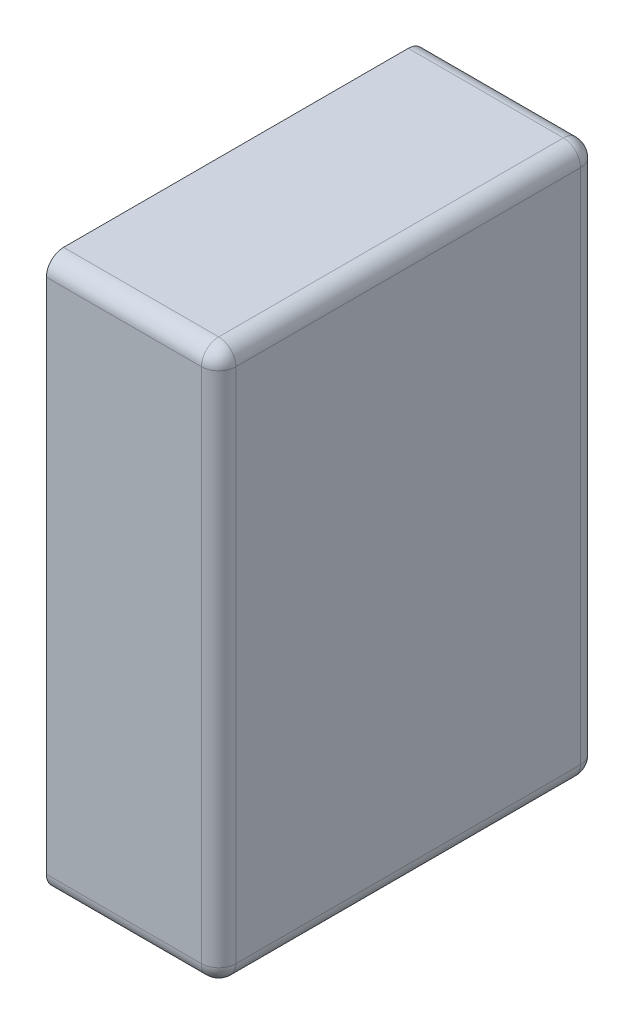
ISO-10303-21;
HEADER;
FILE_DESCRIPTION(('STEP AP214'),'2;1');
FILE_NAME('part.step','',(''),(''),'','','');
FILE_SCHEMA(('AUTOMOTIVE_DESIGN { 1 0 10303 214 1 1 1 1 }'));
ENDSEC;
DATA;
#1=APPLICATION_CONTEXT('core data for automotive mechanical design processes');
#2=APPLICATION_PROTOCOL_DEFINITION('international standard','automotive_design',2000,#1);
#3=PRODUCT_CONTEXT('',#1,'mechanical');
#4=PRODUCT('Part','Part','',(#3));
#5=PRODUCT_RELATED_PRODUCT_CATEGORY('part','',(#4));
#6=PRODUCT_DEFINITION_FORMATION('','',#4);
#7=PRODUCT_DEFINITION_CONTEXT('part definition',#1,'design');
#8=PRODUCT_DEFINITION('design','',#6,#7);
#9=PRODUCT_DEFINITION_SHAPE('','',#8);
#10=(LENGTH_UNIT() NAMED_UNIT(*) SI_UNIT(.MILLI.,.METRE.));
#11=(NAMED_UNIT(*) PLANE_ANGLE_UNIT() SI_UNIT($,.RADIAN.));
#12=(NAMED_UNIT(*) SI_UNIT($,.STERADIAN.) SOLID_ANGLE_UNIT());
#13=UNCERTAINTY_MEASURE_WITH_UNIT(LENGTH_MEASURE(1.E-05),#10,'distance_accuracy_value','');
#14=(GEOMETRIC_REPRESENTATION_CONTEXT(3) GLOBAL_UNCERTAINTY_ASSIGNED_CONTEXT((#13)) GLOBAL_UNIT_ASSIGNED_CONTEXT((#10,
#11,#12)) REPRESENTATION_CONTEXT('',''));
#15=CARTESIAN_POINT('',(0.,0.,0.));
#16=DIRECTION('',(0.,0.,1.));
#17=DIRECTION('',(1.,0.,0.));
#18=AXIS2_PLACEMENT_3D('',#15,#16,#17);
#19=CARTESIAN_POINT('',(3.2,0.,0.));
#20=DIRECTION('',(1.,0.,0.));
#21=DIRECTION('',(0.,0.,-1.));
#22=AXIS2_PLACEMENT_3D('',#19,#20,#21);
#23=PLANE('',#22);
#24=DIRECTION('',(0.,0.,1.));
#25=VECTOR('',#24,1.);
#26=CARTESIAN_POINT('',(3.2,1.55,0.));
#27=LINE('',#26,#25);
#28=CARTESIAN_POINT('',(3.2,1.55,1.05));
#29=VERTEX_POINT('',#28);
#30=CARTESIAN_POINT('',(3.2,1.55,0.05));
#31=VERTEX_POINT('',#30);
#32=EDGE_CURVE('E175',#29,#31,#27,.F.);
#33=ORIENTED_EDGE('',*,*,#32,.F.);
#34=DIRECTION('',(0.,1.,0.));
#35=VECTOR('',#34,1.);
#36=CARTESIAN_POINT('',(3.2,0.,1.05));
#37=LINE('',#36,#35);
#38=CARTESIAN_POINT('',(3.2,0.05,1.05));
#39=VERTEX_POINT('',#38);
#40=EDGE_CURVE('E165',#39,#29,#37,.T.);
#41=ORIENTED_EDGE('',*,*,#40,.F.);
#42=DIRECTION('',(0.,0.,1.));
#43=VECTOR('',#42,1.);
#44=CARTESIAN_POINT('',(3.2,0.05,0.));
#45=LINE('',#44,#43);
#46=CARTESIAN_POINT('',(3.2,0.05,0.05));
#47=VERTEX_POINT('',#46);
#48=EDGE_CURVE('E211',#47,#39,#45,.T.);
#49=ORIENTED_EDGE('',*,*,#48,.F.);
#50=DIRECTION('',(0.,1.,0.));
#51=VECTOR('',#50,1.);
#52=CARTESIAN_POINT('',(3.2,0.,0.05));
#53=LINE('',#52,#51);
#54=EDGE_CURVE('E227',#31,#47,#53,.F.);
#55=ORIENTED_EDGE('',*,*,#54,.F.);
#56=EDGE_LOOP('',(#33,#41,#49,#55));
#57=FACE_BOUND('',#56,.T.);
#58=ADVANCED_FACE('F17',(#57),#23,.T.);
#59=CARTESIAN_POINT('',(3.15,0.05,0.));
#60=DIRECTION('',(0.,0.,1.));
#61=DIRECTION('',(1.,0.,0.));
#62=AXIS2_PLACEMENT_3D('',#59,#60,#61);
#63=CYLINDRICAL_SURFACE('',#62,0.05);
#64=CARTESIAN_POINT('',(3.15,0.05,0.05));
#65=DIRECTION('',(0.,-9.5846697953635E-13,-1.));
#66=DIRECTION('',(1.,0.,0.));
#67=AXIS2_PLACEMENT_3D('',#64,#65,#66);
#68=CIRCLE('',#67,0.05);
#69=CARTESIAN_POINT('',(3.15,0.,0.050000000000012));
#70=VERTEX_POINT('',#69);
#71=EDGE_CURVE('E207',#47,#70,#68,.T.);
#72=ORIENTED_EDGE('',*,*,#71,.F.);
#73=ORIENTED_EDGE('',*,*,#48,.T.);
#74=CARTESIAN_POINT('',(3.15,0.05,1.05));
#75=DIRECTION('',(0.,0.,-1.));
#76=DIRECTION('',(1.,0.,0.));
#77=AXIS2_PLACEMENT_3D('',#74,#75,#76);
#78=CIRCLE('',#77,0.05);
#79=CARTESIAN_POINT('',(3.15,0.,1.05));
#80=VERTEX_POINT('',#79);
#81=EDGE_CURVE('E284',#80,#39,#78,.F.);
#82=ORIENTED_EDGE('',*,*,#81,.F.);
#83=DIRECTION('',(0.,0.,1.));
#84=VECTOR('',#83,1.);
#85=CARTESIAN_POINT('',(3.15,0.,0.));
#86=LINE('',#85,#84);
#87=EDGE_CURVE('E289',#80,#70,#86,.F.);
#88=ORIENTED_EDGE('',*,*,#87,.T.);
#89=EDGE_LOOP('',(#72,#73,#82,#88));
#90=FACE_BOUND('',#89,.T.);
#91=ADVANCED_FACE('F200',(#90),#63,.T.);
#92=CARTESIAN_POINT('',(3.15,0.05,0.05));
#93=DIRECTION('',(1.,0.,0.));
#94=DIRECTION('',(0.,1.,0.));
#95=AXIS2_PLACEMENT_3D('',#92,#93,#94);
#96=SPHERICAL_SURFACE('',#95,0.05);
#97=CARTESIAN_POINT('',(3.15,0.05,0.05));
#98=DIRECTION('',(1.,0.,0.));
#99=DIRECTION('',(0.,0.,-1.));
#100=AXIS2_PLACEMENT_3D('',#97,#98,#99);
#101=CIRCLE('',#100,0.05);
#102=CARTESIAN_POINT('',(3.15,0.05,0.));
#103=VERTEX_POINT('',#102);
#104=EDGE_CURVE('E124',#103,#70,#101,.F.);
#105=ORIENTED_EDGE('',*,*,#104,.F.);
#106=CARTESIAN_POINT('',(3.15,0.05,0.05));
#107=DIRECTION('',(0.,1.,0.));
#108=DIRECTION('',(0.,0.,1.));
#109=AXIS2_PLACEMENT_3D('',#106,#107,#108);
#110=CIRCLE('',#109,0.05);
#111=EDGE_CURVE('E210',#47,#103,#110,.T.);
#112=ORIENTED_EDGE('',*,*,#111,.F.);
#113=ORIENTED_EDGE('',*,*,#71,.T.);
#114=EDGE_LOOP('',(#105,#112,#113));
#115=FACE_BOUND('',#114,.T.);
#116=ADVANCED_FACE('F196',(#115),#96,.T.);
#117=CARTESIAN_POINT('',(3.15,0.,0.05));
#118=DIRECTION('',(0.,1.,0.));
#119=DIRECTION('',(0.,0.,1.));
#120=AXIS2_PLACEMENT_3D('',#117,#118,#119);
#121=CYLINDRICAL_SURFACE('',#120,0.05);
#122=CARTESIAN_POINT('',(3.15,1.55,0.0499999999999999));
#123=DIRECTION('',(0.,1.,0.));
#124=DIRECTION('',(1.,0.,0.));
#125=AXIS2_PLACEMENT_3D('',#122,#123,#124);
#126=CIRCLE('',#125,0.05);
#127=CARTESIAN_POINT('',(3.15,1.55,0.));
#128=VERTEX_POINT('',#127);
#129=EDGE_CURVE('E187',#31,#128,#126,.T.);
#130=ORIENTED_EDGE('',*,*,#129,.F.);
#131=ORIENTED_EDGE('',*,*,#54,.T.);
#132=ORIENTED_EDGE('',*,*,#111,.T.);
#133=DIRECTION('',(0.,1.,0.));
#134=VECTOR('',#133,1.);
#135=CARTESIAN_POINT('',(3.15,0.,0.));
#136=LINE('',#135,#134);
#137=EDGE_CURVE('E74',#103,#128,#136,.T.);
#138=ORIENTED_EDGE('',*,*,#137,.T.);
#139=EDGE_LOOP('',(#130,#131,#132,#138));
#140=FACE_BOUND('',#139,.T.);
#141=ADVANCED_FACE('F192',(#140),#121,.T.);
#142=CARTESIAN_POINT('',(3.15,1.55,0.05));
#143=DIRECTION('',(1.,0.,0.));
#144=DIRECTION('',(0.,1.,0.));
#145=AXIS2_PLACEMENT_3D('',#142,#143,#144);
#146=SPHERICAL_SURFACE('',#145,0.05);
#147=CARTESIAN_POINT('',(3.15,1.55,0.05));
#148=DIRECTION('',(1.,0.,0.));
#149=DIRECTION('',(0.,0.,-1.));
#150=AXIS2_PLACEMENT_3D('',#147,#148,#149);
#151=CIRCLE('',#150,0.05);
#152=CARTESIAN_POINT('',(3.15,1.6,0.05));
#153=VERTEX_POINT('',#152);
#154=EDGE_CURVE('E118',#153,#128,#151,.F.);
#155=ORIENTED_EDGE('',*,*,#154,.F.);
#156=CARTESIAN_POINT('',(3.15,1.55,0.05));
#157=DIRECTION('',(0.,0.,1.));
#158=DIRECTION('',(1.,0.,0.));
#159=AXIS2_PLACEMENT_3D('',#156,#157,#158);
#160=CIRCLE('',#159,0.05);
#161=EDGE_CURVE('E166',#31,#153,#160,.T.);
#162=ORIENTED_EDGE('',*,*,#161,.F.);
#163=ORIENTED_EDGE('',*,*,#129,.T.);
#164=EDGE_LOOP('',(#155,#162,#163));
#165=FACE_BOUND('',#164,.T.);
#166=ADVANCED_FACE('F189',(#165),#146,.T.);
#167=CARTESIAN_POINT('',(3.15,1.55,0.));
#168=DIRECTION('',(0.,0.,1.));
#169=DIRECTION('',(1.,0.,0.));
#170=AXIS2_PLACEMENT_3D('',#167,#168,#169);
#171=CYLINDRICAL_SURFACE('',#170,0.05);
#172=DIRECTION('',(0.,0.,1.));
#173=VECTOR('',#172,1.);
#174=CARTESIAN_POINT('',(3.15,1.6,0.));
#175=LINE('',#174,#173);
#176=CARTESIAN_POINT('',(3.15,1.6,1.05));
#177=VERTEX_POINT('',#176);
#178=EDGE_CURVE('E109',#177,#153,#175,.F.);
#179=ORIENTED_EDGE('',*,*,#178,.F.);
#180=CARTESIAN_POINT('',(3.15,1.55,1.05));
#181=DIRECTION('',(0.,0.,1.));
#182=DIRECTION('',(1.,0.,0.));
#183=AXIS2_PLACEMENT_3D('',#180,#181,#182);
#184=CIRCLE('',#183,0.05);
#185=EDGE_CURVE('E162',#29,#177,#184,.T.);
#186=ORIENTED_EDGE('',*,*,#185,.F.);
#187=ORIENTED_EDGE('',*,*,#32,.T.);
#188=ORIENTED_EDGE('',*,*,#161,.T.);
#189=EDGE_LOOP('',(#179,#186,#187,#188));
#190=FACE_BOUND('',#189,.T.);
#191=ADVANCED_FACE('F154',(#190),#171,.T.);
#192=CARTESIAN_POINT('',(3.15,1.55,1.05));
#193=DIRECTION('',(1.,0.,0.));
#194=DIRECTION('',(0.,0.,1.));
#195=AXIS2_PLACEMENT_3D('',#192,#193,#194);
#196=SPHERICAL_SURFACE('',#195,0.05);
#197=CARTESIAN_POINT('',(3.15,1.55,1.05));
#198=DIRECTION('',(1.,0.,0.));
#199=DIRECTION('',(0.,0.,-1.));
#200=AXIS2_PLACEMENT_3D('',#197,#198,#199);
#201=CIRCLE('',#200,0.05);
#202=CARTESIAN_POINT('',(3.15,1.55,1.1));
#203=VERTEX_POINT('',#202);
#204=EDGE_CURVE('E108',#203,#177,#201,.F.);
#205=ORIENTED_EDGE('',*,*,#204,.F.);
#206=CARTESIAN_POINT('',(3.15,1.55,1.05));
#207=DIRECTION('',(0.,1.,0.));
#208=DIRECTION('',(0.,0.,1.));
#209=AXIS2_PLACEMENT_3D('',#206,#207,#208);
#210=CIRCLE('',#209,0.05);
#211=EDGE_CURVE('E220',#29,#203,#210,.F.);
#212=ORIENTED_EDGE('',*,*,#211,.F.);
#213=ORIENTED_EDGE('',*,*,#185,.T.);
#214=EDGE_LOOP('',(#205,#212,#213));
#215=FACE_BOUND('',#214,.T.);
#216=ADVANCED_FACE('F149',(#215),#196,.T.);
#217=CARTESIAN_POINT('',(3.15,0.,1.05));
#218=DIRECTION('',(0.,1.,0.));
#219=DIRECTION('',(0.,0.,1.));
#220=AXIS2_PLACEMENT_3D('',#217,#218,#219);
#221=CYLINDRICAL_SURFACE('',#220,0.05);
#222=DIRECTION('',(0.,1.,0.));
#223=VECTOR('',#222,1.);
#224=CARTESIAN_POINT('',(3.15,0.,1.1));
#225=LINE('',#224,#223);
#226=CARTESIAN_POINT('',(3.15,0.05,1.1));
#227=VERTEX_POINT('',#226);
#228=EDGE_CURVE('E103',#227,#203,#225,.T.);
#229=ORIENTED_EDGE('',*,*,#228,.F.);
#230=CARTESIAN_POINT('',(3.15,0.0499999999999999,1.05));
#231=DIRECTION('',(0.,-1.,0.));
#232=DIRECTION('',(1.,0.,0.));
#233=AXIS2_PLACEMENT_3D('',#230,#231,#232);
#234=CIRCLE('',#233,0.05);
#235=EDGE_CURVE('E136',#39,#227,#234,.T.);
#236=ORIENTED_EDGE('',*,*,#235,.F.);
#237=ORIENTED_EDGE('',*,*,#40,.T.);
#238=ORIENTED_EDGE('',*,*,#211,.T.);
#239=EDGE_LOOP('',(#229,#236,#237,#238));
#240=FACE_BOUND('',#239,.T.);
#241=ADVANCED_FACE('F144',(#240),#221,.T.);
#242=CARTESIAN_POINT('',(3.15,0.05,1.05));
#243=DIRECTION('',(1.,0.,0.));
#244=DIRECTION('',(0.,-1.,0.));
#245=AXIS2_PLACEMENT_3D('',#242,#243,#244);
#246=SPHERICAL_SURFACE('',#245,0.05);
#247=CARTESIAN_POINT('',(3.15,0.05,1.05));
#248=DIRECTION('',(1.,0.,0.));
#249=DIRECTION('',(0.,0.,-1.));
#250=AXIS2_PLACEMENT_3D('',#247,#248,#249);
#251=CIRCLE('',#250,0.05);
#252=EDGE_CURVE('E90',#80,#227,#251,.F.);
#253=ORIENTED_EDGE('',*,*,#252,.F.);
#254=ORIENTED_EDGE('',*,*,#81,.T.);
#255=ORIENTED_EDGE('',*,*,#235,.T.);
#256=EDGE_LOOP('',(#253,#254,#255));
#257=FACE_BOUND('',#256,.T.);
#258=ADVANCED_FACE('F139',(#257),#246,.T.);
#259=CARTESIAN_POINT('',(0.,0.,0.));
#260=DIRECTION('',(0.,1.,0.));
#261=DIRECTION('',(0.,0.,1.));
#262=AXIS2_PLACEMENT_3D('',#259,#260,#261);
#263=PLANE('',#262);
#264=DIRECTION('',(1.,0.,0.));
#265=VECTOR('',#264,1.);
#266=CARTESIAN_POINT('',(0.,0.,1.05));
#267=LINE('',#266,#265);
#268=CARTESIAN_POINT('',(2.7,0.,1.05));
#269=VERTEX_POINT('',#268);
#270=EDGE_CURVE('E96',#269,#80,#267,.T.);
#271=ORIENTED_EDGE('',*,*,#270,.F.);
#272=DIRECTION('',(0.,0.,-1.));
#273=VECTOR('',#272,1.);
#274=CARTESIAN_POINT('',(2.7,0.,0.));
#275=LINE('',#274,#273);
#276=CARTESIAN_POINT('',(2.7,0.,0.05));
#277=VERTEX_POINT('',#276);
#278=EDGE_CURVE('E86',#269,#277,#275,.T.);
#279=ORIENTED_EDGE('',*,*,#278,.T.);
#280=DIRECTION('',(1.,0.,0.));
#281=VECTOR('',#280,1.);
#282=CARTESIAN_POINT('',(0.,0.,0.05));
#283=LINE('',#282,#281);
#284=EDGE_CURVE('E60',#70,#277,#283,.F.);
#285=ORIENTED_EDGE('',*,*,#284,.F.);
#286=ORIENTED_EDGE('',*,*,#87,.F.);
#287=EDGE_LOOP('',(#271,#279,#285,#286));
#288=FACE_BOUND('',#287,.T.);
#289=ADVANCED_FACE('F143',(#288),#263,.F.);
#290=CARTESIAN_POINT('',(0.,0.05,0.05));
#291=DIRECTION('',(1.,0.,0.));
#292=DIRECTION('',(0.,0.,-1.));
#293=AXIS2_PLACEMENT_3D('',#290,#291,#292);
#294=CYLINDRICAL_SURFACE('',#293,0.05);
#295=ORIENTED_EDGE('',*,*,#104,.T.);
#296=ORIENTED_EDGE('',*,*,#284,.T.);
#297=CARTESIAN_POINT('',(2.7,0.05,0.05));
#298=DIRECTION('',(1.,0.,0.));
#299=DIRECTION('',(0.,0.,-1.));
#300=AXIS2_PLACEMENT_3D('',#297,#298,#299);
#301=CIRCLE('',#300,0.05);
#302=CARTESIAN_POINT('',(2.7,0.05,0.));
#303=VERTEX_POINT('',#302);
#304=EDGE_CURVE('E20',#277,#303,#301,.T.);
#305=ORIENTED_EDGE('',*,*,#304,.T.);
#306=DIRECTION('',(1.,0.,0.));
#307=VECTOR('',#306,1.);
#308=CARTESIAN_POINT('',(0.,0.05,0.));
#309=LINE('',#308,#307);
#310=EDGE_CURVE('E67',#303,#103,#309,.T.);
#311=ORIENTED_EDGE('',*,*,#310,.T.);
#312=EDGE_LOOP('',(#295,#296,#305,#311));
#313=FACE_BOUND('',#312,.T.);
#314=ADVANCED_FACE('F85',(#313),#294,.T.);
#315=CARTESIAN_POINT('',(0.,0.,0.));
#316=DIRECTION('',(0.,0.,1.));
#317=DIRECTION('',(1.,0.,0.));
#318=AXIS2_PLACEMENT_3D('',#315,#316,#317);
#319=PLANE('',#318);
#320=ORIENTED_EDGE('',*,*,#137,.F.);
#321=ORIENTED_EDGE('',*,*,#310,.F.);
#322=DIRECTION('',(0.,1.,0.));
#323=VECTOR('',#322,1.);
#324=CARTESIAN_POINT('',(2.7,0.,0.));
#325=LINE('',#324,#323);
#326=CARTESIAN_POINT('',(2.7,1.55,0.));
#327=VERTEX_POINT('',#326);
#328=EDGE_CURVE('E71',#303,#327,#325,.T.);
#329=ORIENTED_EDGE('',*,*,#328,.T.);
#330=DIRECTION('',(1.,0.,0.));
#331=VECTOR('',#330,1.);
#332=CARTESIAN_POINT('',(0.,1.55,0.));
#333=LINE('',#332,#331);
#334=EDGE_CURVE('E114',#128,#327,#333,.F.);
#335=ORIENTED_EDGE('',*,*,#334,.F.);
#336=EDGE_LOOP('',(#320,#321,#329,#335));
#337=FACE_BOUND('',#336,.T.);
#338=ADVANCED_FACE('F69',(#337),#319,.F.);
#339=CARTESIAN_POINT('',(0.,1.55,0.05));
#340=DIRECTION('',(1.,0.,0.));
#341=DIRECTION('',(0.,0.,-1.));
#342=AXIS2_PLACEMENT_3D('',#339,#340,#341);
#343=CYLINDRICAL_SURFACE('',#342,0.05);
#344=ORIENTED_EDGE('',*,*,#334,.T.);
#345=CARTESIAN_POINT('',(2.7,1.55,0.05));
#346=DIRECTION('',(1.,0.,0.));
#347=DIRECTION('',(0.,0.,-1.));
#348=AXIS2_PLACEMENT_3D('',#345,#346,#347);
#349=CIRCLE('',#348,0.05);
#350=CARTESIAN_POINT('',(2.7,1.6,0.05));
#351=VERTEX_POINT('',#350);
#352=EDGE_CURVE('E83',#327,#351,#349,.T.);
#353=ORIENTED_EDGE('',*,*,#352,.T.);
#354=DIRECTION('',(1.,0.,0.));
#355=VECTOR('',#354,1.);
#356=CARTESIAN_POINT('',(0.,1.6,0.05));
#357=LINE('',#356,#355);
#358=EDGE_CURVE('E112',#153,#351,#357,.F.);
#359=ORIENTED_EDGE('',*,*,#358,.F.);
#360=ORIENTED_EDGE('',*,*,#154,.T.);
#361=EDGE_LOOP('',(#344,#353,#359,#360));
#362=FACE_BOUND('',#361,.T.);
#363=ADVANCED_FACE('F312',(#362),#343,.T.);
#364=CARTESIAN_POINT('',(0.,1.6,0.));
#365=DIRECTION('',(0.,1.,0.));
#366=DIRECTION('',(0.,0.,1.));
#367=AXIS2_PLACEMENT_3D('',#364,#365,#366);
#368=PLANE('',#367);
#369=DIRECTION('',(1.,0.,0.));
#370=VECTOR('',#369,1.);
#371=CARTESIAN_POINT('',(0.,1.6,1.05));
#372=LINE('',#371,#370);
#373=CARTESIAN_POINT('',(2.7,1.6,1.05));
#374=VERTEX_POINT('',#373);
#375=EDGE_CURVE('E106',#177,#374,#372,.F.);
#376=ORIENTED_EDGE('',*,*,#375,.F.);
#377=ORIENTED_EDGE('',*,*,#178,.T.);
#378=ORIENTED_EDGE('',*,*,#358,.T.);
#379=DIRECTION('',(0.,0.,-1.));
#380=VECTOR('',#379,1.);
#381=CARTESIAN_POINT('',(2.7,1.6,0.));
#382=LINE('',#381,#380);
#383=EDGE_CURVE('E234',#351,#374,#382,.F.);
#384=ORIENTED_EDGE('',*,*,#383,.T.);
#385=EDGE_LOOP('',(#376,#377,#378,#384));
#386=FACE_BOUND('',#385,.T.);
#387=ADVANCED_FACE('F252',(#386),#368,.T.);
#388=CARTESIAN_POINT('',(0.,1.55,1.05));
#389=DIRECTION('',(1.,0.,0.));
#390=DIRECTION('',(0.,0.,-1.));
#391=AXIS2_PLACEMENT_3D('',#388,#389,#390);
#392=CYLINDRICAL_SURFACE('',#391,0.05);
#393=DIRECTION('',(1.,0.,0.));
#394=VECTOR('',#393,1.);
#395=CARTESIAN_POINT('',(0.,1.55,1.1));
#396=LINE('',#395,#394);
#397=CARTESIAN_POINT('',(2.7,1.55,1.1));
#398=VERTEX_POINT('',#397);
#399=EDGE_CURVE('E99',#203,#398,#396,.F.);
#400=ORIENTED_EDGE('',*,*,#399,.F.);
#401=ORIENTED_EDGE('',*,*,#204,.T.);
#402=ORIENTED_EDGE('',*,*,#375,.T.);
#403=CARTESIAN_POINT('',(2.7,1.55,1.05));
#404=DIRECTION('',(1.,0.,0.));
#405=DIRECTION('',(0.,0.,-1.));
#406=AXIS2_PLACEMENT_3D('',#403,#404,#405);
#407=CIRCLE('',#406,0.05);
#408=EDGE_CURVE('E232',#374,#398,#407,.T.);
#409=ORIENTED_EDGE('',*,*,#408,.T.);
#410=EDGE_LOOP('',(#400,#401,#402,#409));
#411=FACE_BOUND('',#410,.T.);
#412=ADVANCED_FACE('F247',(#411),#392,.T.);
#413=CARTESIAN_POINT('',(0.,0.,1.1));
#414=DIRECTION('',(0.,0.,1.));
#415=DIRECTION('',(1.,0.,0.));
#416=AXIS2_PLACEMENT_3D('',#413,#414,#415);
#417=PLANE('',#416);
#418=ORIENTED_EDGE('',*,*,#228,.T.);
#419=ORIENTED_EDGE('',*,*,#399,.T.);
#420=DIRECTION('',(0.,1.,0.));
#421=VECTOR('',#420,1.);
#422=CARTESIAN_POINT('',(2.7,0.,1.1));
#423=LINE('',#422,#421);
#424=CARTESIAN_POINT('',(2.7,0.05,1.1));
#425=VERTEX_POINT('',#424);
#426=EDGE_CURVE('E26',#398,#425,#423,.F.);
#427=ORIENTED_EDGE('',*,*,#426,.T.);
#428=DIRECTION('',(1.,0.,0.));
#429=VECTOR('',#428,1.);
#430=CARTESIAN_POINT('',(0.,0.05,1.1));
#431=LINE('',#430,#429);
#432=EDGE_CURVE('E34',#227,#425,#431,.F.);
#433=ORIENTED_EDGE('',*,*,#432,.F.);
#434=EDGE_LOOP('',(#418,#419,#427,#433));
#435=FACE_BOUND('',#434,.T.);
#436=ADVANCED_FACE('F243',(#435),#417,.T.);
#437=CARTESIAN_POINT('',(0.,0.05,1.05));
#438=DIRECTION('',(1.,0.,0.));
#439=DIRECTION('',(0.,0.,-1.));
#440=AXIS2_PLACEMENT_3D('',#437,#438,#439);
#441=CYLINDRICAL_SURFACE('',#440,0.05);
#442=ORIENTED_EDGE('',*,*,#432,.T.);
#443=CARTESIAN_POINT('',(2.7,0.05,1.05));
#444=DIRECTION('',(1.,0.,0.));
#445=DIRECTION('',(0.,0.,-1.));
#446=AXIS2_PLACEMENT_3D('',#443,#444,#445);
#447=CIRCLE('',#446,0.05);
#448=EDGE_CURVE('E11',#425,#269,#447,.T.);
#449=ORIENTED_EDGE('',*,*,#448,.T.);
#450=ORIENTED_EDGE('',*,*,#270,.T.);
#451=ORIENTED_EDGE('',*,*,#252,.T.);
#452=EDGE_LOOP('',(#442,#449,#450,#451));
#453=FACE_BOUND('',#452,.T.);
#454=ADVANCED_FACE('F323',(#453),#441,.T.);
#455=CARTESIAN_POINT('',(2.7,0.,0.));
#456=DIRECTION('',(1.,0.,0.));
#457=DIRECTION('',(0.,0.,-1.));
#458=AXIS2_PLACEMENT_3D('',#455,#456,#457);
#459=PLANE('',#458);
#460=ORIENTED_EDGE('',*,*,#426,.F.);
#461=ORIENTED_EDGE('',*,*,#408,.F.);
#462=ORIENTED_EDGE('',*,*,#383,.F.);
#463=ORIENTED_EDGE('',*,*,#352,.F.);
#464=ORIENTED_EDGE('',*,*,#328,.F.);
#465=ORIENTED_EDGE('',*,*,#304,.F.);
#466=ORIENTED_EDGE('',*,*,#278,.F.);
#467=ORIENTED_EDGE('',*,*,#448,.F.);
#468=EDGE_LOOP('',(#460,#461,#462,#463,#464,#465,#466,#467));
#469=FACE_BOUND('',#468,.T.);
#470=ADVANCED_FACE('F79',(#469),#459,.F.);
#471=CLOSED_SHELL('',(#58,#91,#116,#141,#166,#191,#216,#241,#258,#289,#314,#338,#363,#387,#412,
#436,#454,#470));
#472=MANIFOLD_SOLID_BREP('B1',#471);
#473=ADVANCED_BREP_SHAPE_REPRESENTATION('',(#18,#472),#14);
#474=SHAPE_DEFINITION_REPRESENTATION(#9,#473);
ENDSEC;
END-ISO-10303-21;
